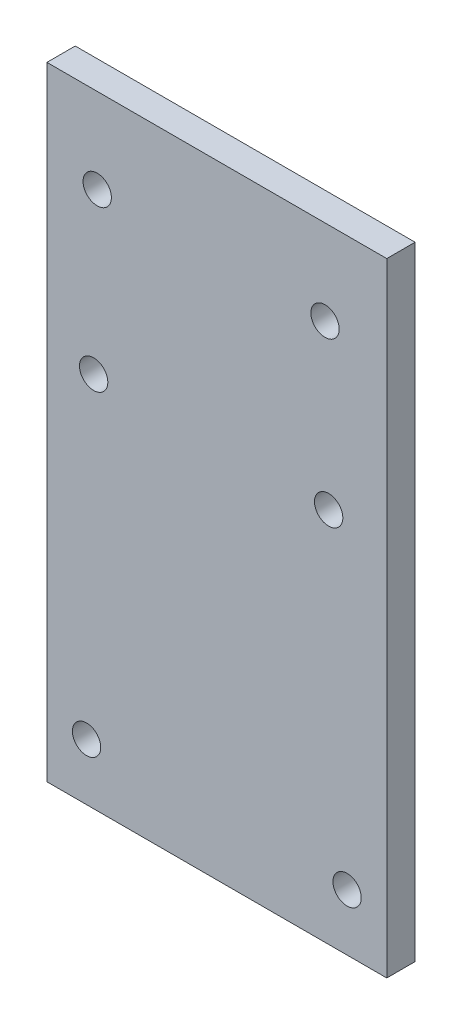
ISO-10303-21;
HEADER;
FILE_DESCRIPTION(('STEP AP214'),'2;1');
FILE_NAME('part.step','',(''),(''),'','','');
FILE_SCHEMA(('AUTOMOTIVE_DESIGN { 1 0 10303 214 1 1 1 1 }'));
ENDSEC;
DATA;
#1=APPLICATION_CONTEXT('core data for automotive mechanical design processes');
#2=APPLICATION_PROTOCOL_DEFINITION('international standard','automotive_design',2000,#1);
#3=PRODUCT_CONTEXT('',#1,'mechanical');
#4=PRODUCT('Part','Part','',(#3));
#5=PRODUCT_RELATED_PRODUCT_CATEGORY('part','',(#4));
#6=PRODUCT_DEFINITION_FORMATION('','',#4);
#7=PRODUCT_DEFINITION_CONTEXT('part definition',#1,'design');
#8=PRODUCT_DEFINITION('design','',#6,#7);
#9=PRODUCT_DEFINITION_SHAPE('','',#8);
#10=(LENGTH_UNIT() NAMED_UNIT(*) SI_UNIT(.MILLI.,.METRE.));
#11=(NAMED_UNIT(*) PLANE_ANGLE_UNIT() SI_UNIT($,.RADIAN.));
#12=(NAMED_UNIT(*) SI_UNIT($,.STERADIAN.) SOLID_ANGLE_UNIT());
#13=UNCERTAINTY_MEASURE_WITH_UNIT(LENGTH_MEASURE(1.E-05),#10,'distance_accuracy_value','');
#14=(GEOMETRIC_REPRESENTATION_CONTEXT(3) GLOBAL_UNCERTAINTY_ASSIGNED_CONTEXT((#13)) GLOBAL_UNIT_ASSIGNED_CONTEXT((#10,
#11,#12)) REPRESENTATION_CONTEXT('',''));
#15=CARTESIAN_POINT('',(0.,0.,0.));
#16=DIRECTION('',(0.,0.,1.));
#17=DIRECTION('',(1.,0.,0.));
#18=AXIS2_PLACEMENT_3D('',#15,#16,#17);
#19=CARTESIAN_POINT('',(0.,0.,5.));
#20=DIRECTION('',(0.,0.,1.));
#21=DIRECTION('',(1.,0.,0.));
#22=AXIS2_PLACEMENT_3D('',#19,#20,#21);
#23=PLANE('',#22);
#24=CARTESIAN_POINT('',(7.00000000000001,-100.,5.));
#25=DIRECTION('',(0.,0.,1.));
#26=DIRECTION('',(1.,0.,0.));
#27=AXIS2_PLACEMENT_3D('',#24,#25,#26);
#28=CIRCLE('',#27,2.5);
#29=CARTESIAN_POINT('',(9.50000000000001,-100.,5.));
#30=VERTEX_POINT('',#29);
#31=EDGE_CURVE('E133',#30,#30,#28,.T.);
#32=ORIENTED_EDGE('',*,*,#31,.F.);
#33=EDGE_LOOP('',(#32));
#34=FACE_BOUND('',#33,.T.);
#35=CARTESIAN_POINT('',(49.7432421346498,-43.5400000000003,5.));
#36=DIRECTION('',(0.,0.,1.));
#37=DIRECTION('',(1.,0.,0.));
#38=AXIS2_PLACEMENT_3D('',#35,#36,#37);
#39=CIRCLE('',#38,2.5);
#40=CARTESIAN_POINT('',(52.2432421346498,-43.5400000000003,5.));
#41=VERTEX_POINT('',#40);
#42=EDGE_CURVE('E121',#41,#41,#39,.T.);
#43=ORIENTED_EDGE('',*,*,#42,.F.);
#44=EDGE_LOOP('',(#43));
#45=FACE_BOUND('',#44,.T.);
#46=CARTESIAN_POINT('',(8.87972640394808,-14.9999999999999,5.));
#47=DIRECTION('',(0.,0.,1.));
#48=DIRECTION('',(1.,0.,0.));
#49=AXIS2_PLACEMENT_3D('',#46,#47,#48);
#50=CIRCLE('',#49,2.5);
#51=CARTESIAN_POINT('',(11.3797264039481,-14.9999999999999,5.));
#52=VERTEX_POINT('',#51);
#53=EDGE_CURVE('E100',#52,#52,#50,.T.);
#54=ORIENTED_EDGE('',*,*,#53,.F.);
#55=EDGE_LOOP('',(#54));
#56=FACE_BOUND('',#55,.T.);
#57=DIRECTION('',(0.,-1.,0.));
#58=VECTOR('',#57,1.);
#59=CARTESIAN_POINT('',(0.,0.,5.));
#60=LINE('',#59,#58);
#61=CARTESIAN_POINT('',(0.,0.,5.));
#62=VERTEX_POINT('',#61);
#63=CARTESIAN_POINT('',(0.,-110.,5.));
#64=VERTEX_POINT('',#63);
#65=EDGE_CURVE('E85',#62,#64,#60,.T.);
#66=ORIENTED_EDGE('',*,*,#65,.T.);
#67=DIRECTION('',(1.,0.,0.));
#68=VECTOR('',#67,1.);
#69=CARTESIAN_POINT('',(0.,-110.,5.));
#70=LINE('',#69,#68);
#71=CARTESIAN_POINT('',(60.,-110.,5.));
#72=VERTEX_POINT('',#71);
#73=EDGE_CURVE('E80',#64,#72,#70,.T.);
#74=ORIENTED_EDGE('',*,*,#73,.T.);
#75=DIRECTION('',(0.,1.,0.));
#76=VECTOR('',#75,1.);
#77=CARTESIAN_POINT('',(60.,0.,5.));
#78=LINE('',#77,#76);
#79=CARTESIAN_POINT('',(60.,0.,5.));
#80=VERTEX_POINT('',#79);
#81=EDGE_CURVE('E83',#72,#80,#78,.T.);
#82=ORIENTED_EDGE('',*,*,#81,.T.);
#83=DIRECTION('',(-1.,0.,0.));
#84=VECTOR('',#83,1.);
#85=CARTESIAN_POINT('',(0.,0.,5.));
#86=LINE('',#85,#84);
#87=EDGE_CURVE('E50',#80,#62,#86,.T.);
#88=ORIENTED_EDGE('',*,*,#87,.T.);
#89=EDGE_LOOP('',(#66,#74,#82,#88));
#90=FACE_BOUND('',#89,.T.);
#91=CARTESIAN_POINT('',(49.0963800916751,-15.0000000000003,5.));
#92=DIRECTION('',(0.,0.,1.));
#93=DIRECTION('',(1.,0.,0.));
#94=AXIS2_PLACEMENT_3D('',#91,#92,#93);
#95=CIRCLE('',#94,2.5);
#96=CARTESIAN_POINT('',(51.5963800916751,-15.0000000000003,5.));
#97=VERTEX_POINT('',#96);
#98=EDGE_CURVE('E115',#97,#97,#95,.T.);
#99=ORIENTED_EDGE('',*,*,#98,.F.);
#100=EDGE_LOOP('',(#99));
#101=FACE_BOUND('',#100,.T.);
#102=CARTESIAN_POINT('',(8.25220751857119,-43.5399999999999,5.));
#103=DIRECTION('',(0.,0.,1.));
#104=DIRECTION('',(1.,0.,0.));
#105=AXIS2_PLACEMENT_3D('',#102,#103,#104);
#106=CIRCLE('',#105,2.5);
#107=CARTESIAN_POINT('',(10.7522075185712,-43.5399999999999,5.));
#108=VERTEX_POINT('',#107);
#109=EDGE_CURVE('E127',#108,#108,#106,.T.);
#110=ORIENTED_EDGE('',*,*,#109,.F.);
#111=EDGE_LOOP('',(#110));
#112=FACE_BOUND('',#111,.T.);
#113=CARTESIAN_POINT('',(53.,-100.,5.));
#114=DIRECTION('',(0.,0.,1.));
#115=DIRECTION('',(-1.,0.,0.));
#116=AXIS2_PLACEMENT_3D('',#113,#114,#115);
#117=CIRCLE('',#116,2.5);
#118=CARTESIAN_POINT('',(50.5,-100.,5.));
#119=VERTEX_POINT('',#118);
#120=EDGE_CURVE('E139',#119,#119,#117,.T.);
#121=ORIENTED_EDGE('',*,*,#120,.F.);
#122=EDGE_LOOP('',(#121));
#123=FACE_BOUND('',#122,.T.);
#124=ADVANCED_FACE('F33',(#34,#45,#56,#90,#101,#112,#123),#23,.T.);
#125=CARTESIAN_POINT('',(0.,0.,0.));
#126=DIRECTION('',(0.,0.,1.));
#127=DIRECTION('',(1.,0.,0.));
#128=AXIS2_PLACEMENT_3D('',#125,#126,#127);
#129=PLANE('',#128);
#130=DIRECTION('',(0.,-1.,0.));
#131=VECTOR('',#130,1.);
#132=CARTESIAN_POINT('',(0.,0.,0.));
#133=LINE('',#132,#131);
#134=CARTESIAN_POINT('',(0.,0.,0.));
#135=VERTEX_POINT('',#134);
#136=CARTESIAN_POINT('',(0.,-110.,0.));
#137=VERTEX_POINT('',#136);
#138=EDGE_CURVE('E97',#135,#137,#133,.T.);
#139=ORIENTED_EDGE('',*,*,#138,.F.);
#140=DIRECTION('',(-1.,0.,0.));
#141=VECTOR('',#140,1.);
#142=CARTESIAN_POINT('',(0.,0.,0.));
#143=LINE('',#142,#141);
#144=CARTESIAN_POINT('',(60.,0.,0.));
#145=VERTEX_POINT('',#144);
#146=EDGE_CURVE('E73',#145,#135,#143,.T.);
#147=ORIENTED_EDGE('',*,*,#146,.F.);
#148=DIRECTION('',(0.,1.,0.));
#149=VECTOR('',#148,1.);
#150=CARTESIAN_POINT('',(60.,0.,0.));
#151=LINE('',#150,#149);
#152=CARTESIAN_POINT('',(60.,-110.,0.));
#153=VERTEX_POINT('',#152);
#154=EDGE_CURVE('E67',#153,#145,#151,.T.);
#155=ORIENTED_EDGE('',*,*,#154,.F.);
#156=DIRECTION('',(1.,0.,0.));
#157=VECTOR('',#156,1.);
#158=CARTESIAN_POINT('',(0.,-110.,0.));
#159=LINE('',#158,#157);
#160=EDGE_CURVE('E89',#137,#153,#159,.T.);
#161=ORIENTED_EDGE('',*,*,#160,.F.);
#162=EDGE_LOOP('',(#139,#147,#155,#161));
#163=FACE_BOUND('',#162,.T.);
#164=CARTESIAN_POINT('',(8.87972640394808,-14.9999999999999,0.));
#165=DIRECTION('',(0.,0.,1.));
#166=DIRECTION('',(1.,0.,0.));
#167=AXIS2_PLACEMENT_3D('',#164,#165,#166);
#168=CIRCLE('',#167,2.5);
#169=CARTESIAN_POINT('',(11.3797264039481,-14.9999999999999,0.));
#170=VERTEX_POINT('',#169);
#171=EDGE_CURVE('E112',#170,#170,#168,.T.);
#172=ORIENTED_EDGE('',*,*,#171,.T.);
#173=EDGE_LOOP('',(#172));
#174=FACE_BOUND('',#173,.T.);
#175=CARTESIAN_POINT('',(49.0963800916751,-15.0000000000003,0.));
#176=DIRECTION('',(0.,0.,1.));
#177=DIRECTION('',(1.,0.,0.));
#178=AXIS2_PLACEMENT_3D('',#175,#176,#177);
#179=CIRCLE('',#178,2.5);
#180=CARTESIAN_POINT('',(51.5963800916751,-15.0000000000003,0.));
#181=VERTEX_POINT('',#180);
#182=EDGE_CURVE('E118',#181,#181,#179,.T.);
#183=ORIENTED_EDGE('',*,*,#182,.T.);
#184=EDGE_LOOP('',(#183));
#185=FACE_BOUND('',#184,.T.);
#186=CARTESIAN_POINT('',(49.7432421346498,-43.5400000000003,0.));
#187=DIRECTION('',(0.,0.,1.));
#188=DIRECTION('',(1.,0.,0.));
#189=AXIS2_PLACEMENT_3D('',#186,#187,#188);
#190=CIRCLE('',#189,2.5);
#191=CARTESIAN_POINT('',(52.2432421346498,-43.5400000000003,0.));
#192=VERTEX_POINT('',#191);
#193=EDGE_CURVE('E124',#192,#192,#190,.T.);
#194=ORIENTED_EDGE('',*,*,#193,.T.);
#195=EDGE_LOOP('',(#194));
#196=FACE_BOUND('',#195,.T.);
#197=CARTESIAN_POINT('',(8.25220751857119,-43.5399999999999,0.));
#198=DIRECTION('',(0.,0.,1.));
#199=DIRECTION('',(1.,0.,0.));
#200=AXIS2_PLACEMENT_3D('',#197,#198,#199);
#201=CIRCLE('',#200,2.5);
#202=CARTESIAN_POINT('',(10.7522075185712,-43.5399999999999,0.));
#203=VERTEX_POINT('',#202);
#204=EDGE_CURVE('E130',#203,#203,#201,.T.);
#205=ORIENTED_EDGE('',*,*,#204,.T.);
#206=EDGE_LOOP('',(#205));
#207=FACE_BOUND('',#206,.T.);
#208=CARTESIAN_POINT('',(7.00000000000001,-100.,0.));
#209=DIRECTION('',(0.,0.,1.));
#210=DIRECTION('',(1.,0.,0.));
#211=AXIS2_PLACEMENT_3D('',#208,#209,#210);
#212=CIRCLE('',#211,2.5);
#213=CARTESIAN_POINT('',(9.50000000000001,-100.,0.));
#214=VERTEX_POINT('',#213);
#215=EDGE_CURVE('E136',#214,#214,#212,.T.);
#216=ORIENTED_EDGE('',*,*,#215,.T.);
#217=EDGE_LOOP('',(#216));
#218=FACE_BOUND('',#217,.T.);
#219=CARTESIAN_POINT('',(53.,-100.,0.));
#220=DIRECTION('',(0.,0.,1.));
#221=DIRECTION('',(-1.,0.,0.));
#222=AXIS2_PLACEMENT_3D('',#219,#220,#221);
#223=CIRCLE('',#222,2.5);
#224=CARTESIAN_POINT('',(50.5,-100.,0.));
#225=VERTEX_POINT('',#224);
#226=EDGE_CURVE('E142',#225,#225,#223,.T.);
#227=ORIENTED_EDGE('',*,*,#226,.T.);
#228=EDGE_LOOP('',(#227));
#229=FACE_BOUND('',#228,.T.);
#230=ADVANCED_FACE('F108',(#163,#174,#185,#196,#207,#218,#229),#129,.F.);
#231=CARTESIAN_POINT('',(0.,0.,5.));
#232=DIRECTION('',(1.,0.,0.));
#233=DIRECTION('',(0.,1.,0.));
#234=AXIS2_PLACEMENT_3D('',#231,#232,#233);
#235=PLANE('',#234);
#236=ORIENTED_EDGE('',*,*,#138,.T.);
#237=DIRECTION('',(0.,0.,-1.));
#238=VECTOR('',#237,1.);
#239=CARTESIAN_POINT('',(0.,-110.,5.));
#240=LINE('',#239,#238);
#241=EDGE_CURVE('E11',#64,#137,#240,.T.);
#242=ORIENTED_EDGE('',*,*,#241,.F.);
#243=ORIENTED_EDGE('',*,*,#65,.F.);
#244=DIRECTION('',(0.,0.,-1.));
#245=VECTOR('',#244,1.);
#246=CARTESIAN_POINT('',(0.,0.,5.));
#247=LINE('',#246,#245);
#248=EDGE_CURVE('E93',#62,#135,#247,.T.);
#249=ORIENTED_EDGE('',*,*,#248,.T.);
#250=EDGE_LOOP('',(#236,#242,#243,#249));
#251=FACE_BOUND('',#250,.T.);
#252=ADVANCED_FACE('F35',(#251),#235,.F.);
#253=CARTESIAN_POINT('',(0.,-110.,5.));
#254=DIRECTION('',(0.,1.,0.));
#255=DIRECTION('',(-1.,0.,0.));
#256=AXIS2_PLACEMENT_3D('',#253,#254,#255);
#257=PLANE('',#256);
#258=ORIENTED_EDGE('',*,*,#160,.T.);
#259=DIRECTION('',(0.,0.,-1.));
#260=VECTOR('',#259,1.);
#261=CARTESIAN_POINT('',(60.,-110.,5.));
#262=LINE('',#261,#260);
#263=EDGE_CURVE('E42',#72,#153,#262,.T.);
#264=ORIENTED_EDGE('',*,*,#263,.F.);
#265=ORIENTED_EDGE('',*,*,#73,.F.);
#266=ORIENTED_EDGE('',*,*,#241,.T.);
#267=EDGE_LOOP('',(#258,#264,#265,#266));
#268=FACE_BOUND('',#267,.T.);
#269=ADVANCED_FACE('F88',(#268),#257,.F.);
#270=CARTESIAN_POINT('',(60.,0.,5.));
#271=DIRECTION('',(-1.,0.,0.));
#272=DIRECTION('',(0.,-1.,0.));
#273=AXIS2_PLACEMENT_3D('',#270,#271,#272);
#274=PLANE('',#273);
#275=ORIENTED_EDGE('',*,*,#154,.T.);
#276=DIRECTION('',(0.,0.,-1.));
#277=VECTOR('',#276,1.);
#278=CARTESIAN_POINT('',(60.,0.,5.));
#279=LINE('',#278,#277);
#280=EDGE_CURVE('E90',#80,#145,#279,.T.);
#281=ORIENTED_EDGE('',*,*,#280,.F.);
#282=ORIENTED_EDGE('',*,*,#81,.F.);
#283=ORIENTED_EDGE('',*,*,#263,.T.);
#284=EDGE_LOOP('',(#275,#281,#282,#283));
#285=FACE_BOUND('',#284,.T.);
#286=ADVANCED_FACE('F91',(#285),#274,.F.);
#287=CARTESIAN_POINT('',(0.,0.,5.));
#288=DIRECTION('',(0.,-1.,0.));
#289=DIRECTION('',(0.,0.,-1.));
#290=AXIS2_PLACEMENT_3D('',#287,#288,#289);
#291=PLANE('',#290);
#292=ORIENTED_EDGE('',*,*,#146,.T.);
#293=ORIENTED_EDGE('',*,*,#248,.F.);
#294=ORIENTED_EDGE('',*,*,#87,.F.);
#295=ORIENTED_EDGE('',*,*,#280,.T.);
#296=EDGE_LOOP('',(#292,#293,#294,#295));
#297=FACE_BOUND('',#296,.T.);
#298=ADVANCED_FACE('F105',(#297),#291,.F.);
#299=CARTESIAN_POINT('',(8.87972640394808,-14.9999999999999,5.));
#300=DIRECTION('',(0.,0.,-1.));
#301=DIRECTION('',(-1.,0.,0.));
#302=AXIS2_PLACEMENT_3D('',#299,#300,#301);
#303=CYLINDRICAL_SURFACE('',#302,2.5);
#304=ORIENTED_EDGE('',*,*,#53,.T.);
#305=EDGE_LOOP('',(#304));
#306=FACE_BOUND('',#305,.T.);
#307=ORIENTED_EDGE('',*,*,#171,.F.);
#308=EDGE_LOOP('',(#307));
#309=FACE_BOUND('',#308,.T.);
#310=ADVANCED_FACE('F161',(#306,#309),#303,.F.);
#311=CARTESIAN_POINT('',(49.0963800916751,-15.0000000000003,5.));
#312=DIRECTION('',(0.,0.,-1.));
#313=DIRECTION('',(-1.,0.,0.));
#314=AXIS2_PLACEMENT_3D('',#311,#312,#313);
#315=CYLINDRICAL_SURFACE('',#314,2.5);
#316=ORIENTED_EDGE('',*,*,#98,.T.);
#317=EDGE_LOOP('',(#316));
#318=FACE_BOUND('',#317,.T.);
#319=ORIENTED_EDGE('',*,*,#182,.F.);
#320=EDGE_LOOP('',(#319));
#321=FACE_BOUND('',#320,.T.);
#322=ADVANCED_FACE('F207',(#318,#321),#315,.F.);
#323=CARTESIAN_POINT('',(49.7432421346498,-43.5400000000003,5.));
#324=DIRECTION('',(0.,0.,-1.));
#325=DIRECTION('',(-1.,0.,0.));
#326=AXIS2_PLACEMENT_3D('',#323,#324,#325);
#327=CYLINDRICAL_SURFACE('',#326,2.5);
#328=ORIENTED_EDGE('',*,*,#42,.T.);
#329=EDGE_LOOP('',(#328));
#330=FACE_BOUND('',#329,.T.);
#331=ORIENTED_EDGE('',*,*,#193,.F.);
#332=EDGE_LOOP('',(#331));
#333=FACE_BOUND('',#332,.T.);
#334=ADVANCED_FACE('F215',(#330,#333),#327,.F.);
#335=CARTESIAN_POINT('',(8.25220751857119,-43.5399999999999,5.));
#336=DIRECTION('',(0.,0.,-1.));
#337=DIRECTION('',(-1.,0.,0.));
#338=AXIS2_PLACEMENT_3D('',#335,#336,#337);
#339=CYLINDRICAL_SURFACE('',#338,2.5);
#340=ORIENTED_EDGE('',*,*,#109,.T.);
#341=EDGE_LOOP('',(#340));
#342=FACE_BOUND('',#341,.T.);
#343=ORIENTED_EDGE('',*,*,#204,.F.);
#344=EDGE_LOOP('',(#343));
#345=FACE_BOUND('',#344,.T.);
#346=ADVANCED_FACE('F223',(#342,#345),#339,.F.);
#347=CARTESIAN_POINT('',(7.00000000000001,-100.,5.));
#348=DIRECTION('',(0.,0.,-1.));
#349=DIRECTION('',(-1.,0.,0.));
#350=AXIS2_PLACEMENT_3D('',#347,#348,#349);
#351=CYLINDRICAL_SURFACE('',#350,2.5);
#352=ORIENTED_EDGE('',*,*,#31,.T.);
#353=EDGE_LOOP('',(#352));
#354=FACE_BOUND('',#353,.T.);
#355=ORIENTED_EDGE('',*,*,#215,.F.);
#356=EDGE_LOOP('',(#355));
#357=FACE_BOUND('',#356,.T.);
#358=ADVANCED_FACE('F232',(#354,#357),#351,.F.);
#359=CARTESIAN_POINT('',(53.,-100.,5.));
#360=DIRECTION('',(0.,0.,-1.));
#361=DIRECTION('',(-1.,0.,0.));
#362=AXIS2_PLACEMENT_3D('',#359,#360,#361);
#363=CYLINDRICAL_SURFACE('',#362,2.5);
#364=ORIENTED_EDGE('',*,*,#120,.T.);
#365=EDGE_LOOP('',(#364));
#366=FACE_BOUND('',#365,.T.);
#367=ORIENTED_EDGE('',*,*,#226,.F.);
#368=EDGE_LOOP('',(#367));
#369=FACE_BOUND('',#368,.T.);
#370=ADVANCED_FACE('F148',(#366,#369),#363,.F.);
#371=CLOSED_SHELL('',(#124,#230,#252,#269,#286,#298,#310,#322,#334,#346,#358,#370));
#372=MANIFOLD_SOLID_BREP('B2',#371);
#373=ADVANCED_BREP_SHAPE_REPRESENTATION('',(#18,#372),#14);
#374=SHAPE_DEFINITION_REPRESENTATION(#9,#373);
ENDSEC;
END-ISO-10303-21;
